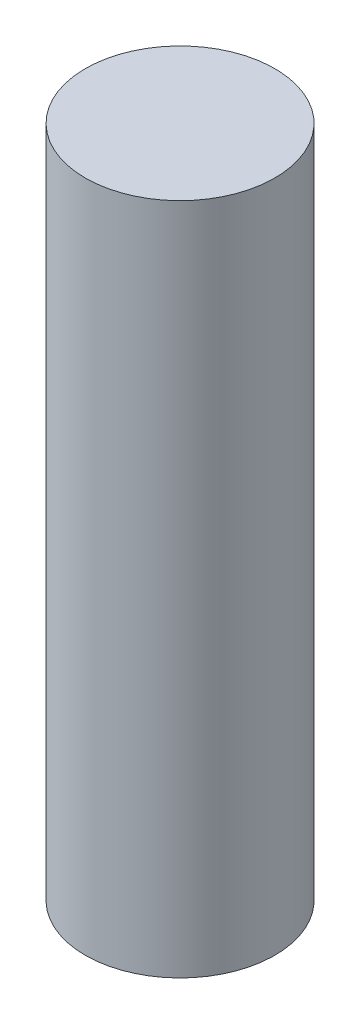
ISO-10303-21;
HEADER;
FILE_DESCRIPTION(('STEP AP214'),'2;1');
FILE_NAME('part.step','',(''),(''),'','','');
FILE_SCHEMA(('AUTOMOTIVE_DESIGN { 1 0 10303 214 1 1 1 1 }'));
ENDSEC;
DATA;
#1=APPLICATION_CONTEXT('core data for automotive mechanical design processes');
#2=APPLICATION_PROTOCOL_DEFINITION('international standard','automotive_design',2000,#1);
#3=PRODUCT_CONTEXT('',#1,'mechanical');
#4=PRODUCT('Part','Part','',(#3));
#5=PRODUCT_RELATED_PRODUCT_CATEGORY('part','',(#4));
#6=PRODUCT_DEFINITION_FORMATION('','',#4);
#7=PRODUCT_DEFINITION_CONTEXT('part definition',#1,'design');
#8=PRODUCT_DEFINITION('design','',#6,#7);
#9=PRODUCT_DEFINITION_SHAPE('','',#8);
#10=(LENGTH_UNIT() NAMED_UNIT(*) SI_UNIT(.MILLI.,.METRE.));
#11=(NAMED_UNIT(*) PLANE_ANGLE_UNIT() SI_UNIT($,.RADIAN.));
#12=(NAMED_UNIT(*) SI_UNIT($,.STERADIAN.) SOLID_ANGLE_UNIT());
#13=UNCERTAINTY_MEASURE_WITH_UNIT(LENGTH_MEASURE(1.E-05),#10,'distance_accuracy_value','');
#14=(GEOMETRIC_REPRESENTATION_CONTEXT(3) GLOBAL_UNCERTAINTY_ASSIGNED_CONTEXT((#13)) GLOBAL_UNIT_ASSIGNED_CONTEXT((#10,
#11,#12)) REPRESENTATION_CONTEXT('',''));
#15=CARTESIAN_POINT('',(0.,0.,0.));
#16=DIRECTION('',(0.,0.,1.));
#17=DIRECTION('',(1.,0.,0.));
#18=AXIS2_PLACEMENT_3D('',#15,#16,#17);
#19=CARTESIAN_POINT('',(0.,32.5,0.));
#20=DIRECTION('',(0.,-1.,0.));
#21=DIRECTION('',(0.,0.,-1.));
#22=AXIS2_PLACEMENT_3D('',#19,#20,#21);
#23=CYLINDRICAL_SURFACE('',#22,9.15);
#24=CARTESIAN_POINT('',(0.,32.5,0.));
#25=DIRECTION('',(0.,1.,0.));
#26=DIRECTION('',(0.,0.,1.));
#27=AXIS2_PLACEMENT_3D('',#24,#25,#26);
#28=CIRCLE('',#27,9.15);
#29=CARTESIAN_POINT('',(0.,32.5,9.15));
#30=VERTEX_POINT('',#29);
#31=EDGE_CURVE('E10',#30,#30,#28,.T.);
#32=ORIENTED_EDGE('',*,*,#31,.F.);
#33=EDGE_LOOP('',(#32));
#34=FACE_BOUND('',#33,.T.);
#35=CARTESIAN_POINT('',(0.,-32.5,0.));
#36=DIRECTION('',(0.,1.,0.));
#37=DIRECTION('',(0.,0.,1.));
#38=AXIS2_PLACEMENT_3D('',#35,#36,#37);
#39=CIRCLE('',#38,9.15);
#40=CARTESIAN_POINT('',(0.,-32.5,9.15));
#41=VERTEX_POINT('',#40);
#42=EDGE_CURVE('E40',#41,#41,#39,.T.);
#43=ORIENTED_EDGE('',*,*,#42,.T.);
#44=EDGE_LOOP('',(#43));
#45=FACE_BOUND('',#44,.T.);
#46=ADVANCED_FACE('F37',(#34,#45),#23,.T.);
#47=CARTESIAN_POINT('',(0.,32.5,0.));
#48=DIRECTION('',(0.,1.,0.));
#49=DIRECTION('',(0.,0.,1.));
#50=AXIS2_PLACEMENT_3D('',#47,#48,#49);
#51=PLANE('',#50);
#52=ORIENTED_EDGE('',*,*,#31,.T.);
#53=EDGE_LOOP('',(#52));
#54=FACE_BOUND('',#53,.T.);
#55=ADVANCED_FACE('F52',(#54),#51,.T.);
#56=CARTESIAN_POINT('',(0.,-32.5,0.));
#57=DIRECTION('',(0.,1.,0.));
#58=DIRECTION('',(0.,0.,1.));
#59=AXIS2_PLACEMENT_3D('',#56,#57,#58);
#60=PLANE('',#59);
#61=ORIENTED_EDGE('',*,*,#42,.F.);
#62=EDGE_LOOP('',(#61));
#63=FACE_BOUND('',#62,.T.);
#64=ADVANCED_FACE('F50',(#63),#60,.F.);
#65=CLOSED_SHELL('',(#46,#55,#64));
#66=MANIFOLD_SOLID_BREP('B2',#65);
#67=ADVANCED_BREP_SHAPE_REPRESENTATION('',(#18,#66),#14);
#68=SHAPE_DEFINITION_REPRESENTATION(#9,#67);
ENDSEC;
END-ISO-10303-21;
